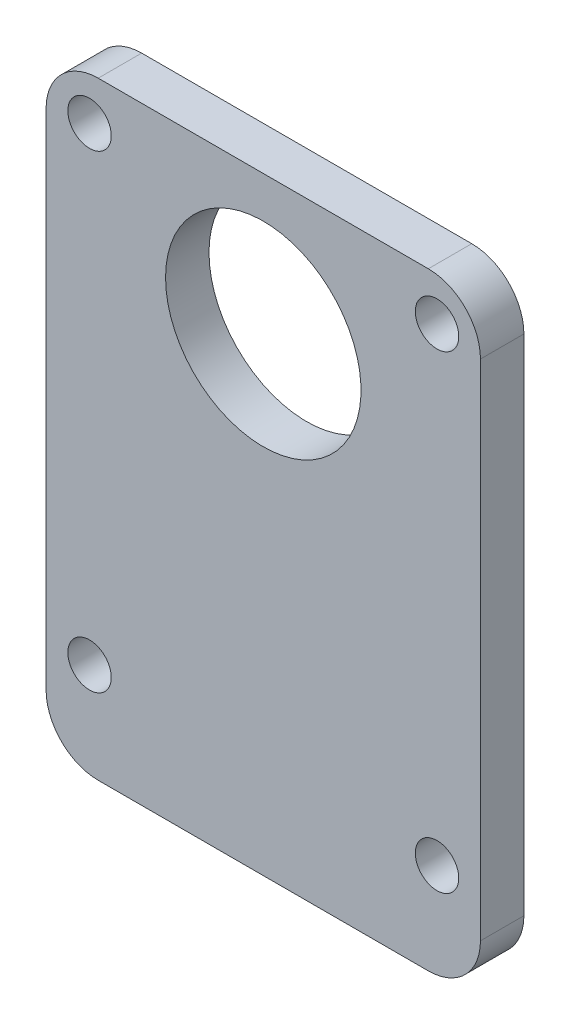
ISO-10303-21;
HEADER;
FILE_DESCRIPTION(('STEP AP214'),'2;1');
FILE_NAME('part.step','',(''),(''),'','','');
FILE_SCHEMA(('AUTOMOTIVE_DESIGN { 1 0 10303 214 1 1 1 1 }'));
ENDSEC;
DATA;
#1=APPLICATION_CONTEXT('core data for automotive mechanical design processes');
#2=APPLICATION_PROTOCOL_DEFINITION('international standard','automotive_design',2000,#1);
#3=PRODUCT_CONTEXT('',#1,'mechanical');
#4=PRODUCT('Part','Part','',(#3));
#5=PRODUCT_RELATED_PRODUCT_CATEGORY('part','',(#4));
#6=PRODUCT_DEFINITION_FORMATION('','',#4);
#7=PRODUCT_DEFINITION_CONTEXT('part definition',#1,'design');
#8=PRODUCT_DEFINITION('design','',#6,#7);
#9=PRODUCT_DEFINITION_SHAPE('','',#8);
#10=(LENGTH_UNIT() NAMED_UNIT(*) SI_UNIT(.MILLI.,.METRE.));
#11=(NAMED_UNIT(*) PLANE_ANGLE_UNIT() SI_UNIT($,.RADIAN.));
#12=(NAMED_UNIT(*) SI_UNIT($,.STERADIAN.) SOLID_ANGLE_UNIT());
#13=UNCERTAINTY_MEASURE_WITH_UNIT(LENGTH_MEASURE(1.E-05),#10,'distance_accuracy_value','');
#14=(GEOMETRIC_REPRESENTATION_CONTEXT(3) GLOBAL_UNCERTAINTY_ASSIGNED_CONTEXT((#13)) GLOBAL_UNIT_ASSIGNED_CONTEXT((#10,
#11,#12)) REPRESENTATION_CONTEXT('',''));
#15=CARTESIAN_POINT('',(0.,0.,0.));
#16=DIRECTION('',(0.,0.,1.));
#17=DIRECTION('',(1.,0.,0.));
#18=AXIS2_PLACEMENT_3D('',#15,#16,#17);
#19=CARTESIAN_POINT('',(-18.1,-22.0973062704397,-6.35));
#20=DIRECTION('',(0.,0.,-1.));
#21=DIRECTION('',(-1.,0.,0.));
#22=AXIS2_PLACEMENT_3D('',#19,#20,#21);
#23=PLANE('',#22);
#24=CARTESIAN_POINT('',(0.,17.8847845003735,-6.35));
#25=DIRECTION('',(0.,0.,-1.));
#26=DIRECTION('',(-1.,0.,0.));
#27=AXIS2_PLACEMENT_3D('',#24,#25,#26);
#28=CIRCLE('',#27,14.2875);
#29=CARTESIAN_POINT('',(-14.2875,17.8847845003735,-6.35));
#30=VERTEX_POINT('',#29);
#31=EDGE_CURVE('E192',#30,#30,#28,.T.);
#32=ORIENTED_EDGE('',*,*,#31,.F.);
#33=EDGE_LOOP('',(#32));
#34=FACE_BOUND('',#33,.T.);
#35=CARTESIAN_POINT('',(25.4,31.8547845003731,-6.35));
#36=DIRECTION('',(0.,0.,-1.));
#37=DIRECTION('',(-1.,0.,0.));
#38=AXIS2_PLACEMENT_3D('',#35,#36,#37);
#39=CIRCLE('',#38,3.175);
#40=CARTESIAN_POINT('',(22.225,31.8547845003731,-6.35));
#41=VERTEX_POINT('',#40);
#42=EDGE_CURVE('E187',#41,#41,#39,.T.);
#43=ORIENTED_EDGE('',*,*,#42,.F.);
#44=EDGE_LOOP('',(#43));
#45=FACE_BOUND('',#44,.T.);
#46=CARTESIAN_POINT('',(25.3999999999993,-36.7252154996269,-6.35));
#47=DIRECTION('',(0.,0.,-1.));
#48=DIRECTION('',(-1.,0.,0.));
#49=AXIS2_PLACEMENT_3D('',#46,#47,#48);
#50=CIRCLE('',#49,3.175);
#51=CARTESIAN_POINT('',(22.2249999999993,-36.7252154996269,-6.35));
#52=VERTEX_POINT('',#51);
#53=EDGE_CURVE('E181',#52,#52,#50,.T.);
#54=ORIENTED_EDGE('',*,*,#53,.F.);
#55=EDGE_LOOP('',(#54));
#56=FACE_BOUND('',#55,.T.);
#57=CARTESIAN_POINT('',(-25.4000000000007,-36.7252154996265,-6.35));
#58=DIRECTION('',(0.,0.,-1.));
#59=DIRECTION('',(-1.,0.,0.));
#60=AXIS2_PLACEMENT_3D('',#57,#58,#59);
#61=CIRCLE('',#60,3.175);
#62=CARTESIAN_POINT('',(-28.5750000000007,-36.7252154996265,-6.35));
#63=VERTEX_POINT('',#62);
#64=EDGE_CURVE('E174',#63,#63,#61,.T.);
#65=ORIENTED_EDGE('',*,*,#64,.F.);
#66=EDGE_LOOP('',(#65));
#67=FACE_BOUND('',#66,.T.);
#68=CARTESIAN_POINT('',(-25.4,31.8547845003735,-6.35));
#69=DIRECTION('',(0.,0.,-1.));
#70=DIRECTION('',(-1.,0.,0.));
#71=AXIS2_PLACEMENT_3D('',#68,#69,#70);
#72=CIRCLE('',#71,3.175);
#73=CARTESIAN_POINT('',(-28.575,31.8547845003735,-6.35));
#74=VERTEX_POINT('',#73);
#75=EDGE_CURVE('E168',#74,#74,#72,.T.);
#76=ORIENTED_EDGE('',*,*,#75,.F.);
#77=EDGE_LOOP('',(#76));
#78=FACE_BOUND('',#77,.T.);
#79=DIRECTION('',(-1.,0.,0.));
#80=VECTOR('',#79,1.);
#81=CARTESIAN_POINT('',(31.75,-50.6952154996265,-6.35));
#82=LINE('',#81,#80);
#83=CARTESIAN_POINT('',(24.13,-50.6952154996265,-6.35));
#84=VERTEX_POINT('',#83);
#85=CARTESIAN_POINT('',(-24.13,-50.6952154996265,-6.35));
#86=VERTEX_POINT('',#85);
#87=EDGE_CURVE('E102',#84,#86,#82,.T.);
#88=ORIENTED_EDGE('',*,*,#87,.T.);
#89=CARTESIAN_POINT('',(-24.13,-43.0752154996265,-6.35));
#90=DIRECTION('',(0.,0.,-1.));
#91=DIRECTION('',(-1.,0.,0.));
#92=AXIS2_PLACEMENT_3D('',#89,#90,#91);
#93=CIRCLE('',#92,7.62);
#94=CARTESIAN_POINT('',(-31.75,-43.0752154996265,-6.35));
#95=VERTEX_POINT('',#94);
#96=EDGE_CURVE('E109',#86,#95,#93,.T.);
#97=ORIENTED_EDGE('',*,*,#96,.T.);
#98=DIRECTION('',(0.,1.,0.));
#99=VECTOR('',#98,1.);
#100=CARTESIAN_POINT('',(-31.75,38.2047845003735,-6.35));
#101=LINE('',#100,#99);
#102=CARTESIAN_POINT('',(-31.75,30.5847845003735,-6.35));
#103=VERTEX_POINT('',#102);
#104=EDGE_CURVE('E158',#95,#103,#101,.T.);
#105=ORIENTED_EDGE('',*,*,#104,.T.);
#106=CARTESIAN_POINT('',(-24.13,30.5847845003735,-6.35));
#107=DIRECTION('',(0.,0.,-1.));
#108=DIRECTION('',(-1.,0.,0.));
#109=AXIS2_PLACEMENT_3D('',#106,#107,#108);
#110=CIRCLE('',#109,7.62);
#111=CARTESIAN_POINT('',(-24.13,38.2047845003735,-6.35));
#112=VERTEX_POINT('',#111);
#113=EDGE_CURVE('E110',#103,#112,#110,.T.);
#114=ORIENTED_EDGE('',*,*,#113,.T.);
#115=DIRECTION('',(1.,0.,0.));
#116=VECTOR('',#115,1.);
#117=CARTESIAN_POINT('',(31.75,38.2047845003735,-6.35));
#118=LINE('',#117,#116);
#119=CARTESIAN_POINT('',(24.13,38.2047845003735,-6.35));
#120=VERTEX_POINT('',#119);
#121=EDGE_CURVE('E154',#112,#120,#118,.T.);
#122=ORIENTED_EDGE('',*,*,#121,.T.);
#123=CARTESIAN_POINT('',(24.13,30.5847845003735,-6.35));
#124=DIRECTION('',(0.,0.,-1.));
#125=DIRECTION('',(-1.,0.,0.));
#126=AXIS2_PLACEMENT_3D('',#123,#124,#125);
#127=CIRCLE('',#126,7.62);
#128=CARTESIAN_POINT('',(31.75,30.5847845003735,-6.35));
#129=VERTEX_POINT('',#128);
#130=EDGE_CURVE('E127',#120,#129,#127,.T.);
#131=ORIENTED_EDGE('',*,*,#130,.T.);
#132=DIRECTION('',(0.,-1.,0.));
#133=VECTOR('',#132,1.);
#134=CARTESIAN_POINT('',(31.75,38.2047845003735,-6.35));
#135=LINE('',#134,#133);
#136=CARTESIAN_POINT('',(31.75,-43.0752154996265,-6.35));
#137=VERTEX_POINT('',#136);
#138=EDGE_CURVE('E104',#129,#137,#135,.T.);
#139=ORIENTED_EDGE('',*,*,#138,.T.);
#140=CARTESIAN_POINT('',(24.13,-43.0752154996265,-6.35));
#141=DIRECTION('',(0.,0.,-1.));
#142=DIRECTION('',(-1.,0.,0.));
#143=AXIS2_PLACEMENT_3D('',#140,#141,#142);
#144=CIRCLE('',#143,7.62);
#145=EDGE_CURVE('E100',#137,#84,#144,.T.);
#146=ORIENTED_EDGE('',*,*,#145,.T.);
#147=EDGE_LOOP('',(#88,#97,#105,#114,#122,#131,#139,#146));
#148=FACE_BOUND('',#147,.T.);
#149=ADVANCED_FACE('F35',(#34,#45,#56,#67,#78,#148),#23,.T.);
#150=CARTESIAN_POINT('',(-18.1,-22.0973062704397,0.));
#151=DIRECTION('',(0.,0.,-1.));
#152=DIRECTION('',(-1.,0.,0.));
#153=AXIS2_PLACEMENT_3D('',#150,#151,#152);
#154=PLANE('',#153);
#155=CARTESIAN_POINT('',(0.,17.8847845003735,0.));
#156=DIRECTION('',(0.,0.,-1.));
#157=DIRECTION('',(-1.,0.,0.));
#158=AXIS2_PLACEMENT_3D('',#155,#156,#157);
#159=CIRCLE('',#158,14.2875);
#160=CARTESIAN_POINT('',(-14.2875,17.8847845003735,0.));
#161=VERTEX_POINT('',#160);
#162=EDGE_CURVE('E178',#161,#161,#159,.T.);
#163=ORIENTED_EDGE('',*,*,#162,.T.);
#164=EDGE_LOOP('',(#163));
#165=FACE_BOUND('',#164,.T.);
#166=CARTESIAN_POINT('',(25.4,31.8547845003731,0.));
#167=DIRECTION('',(0.,0.,-1.));
#168=DIRECTION('',(-1.,0.,0.));
#169=AXIS2_PLACEMENT_3D('',#166,#167,#168);
#170=CIRCLE('',#169,3.175);
#171=CARTESIAN_POINT('',(22.225,31.8547845003731,0.));
#172=VERTEX_POINT('',#171);
#173=EDGE_CURVE('E171',#172,#172,#170,.T.);
#174=ORIENTED_EDGE('',*,*,#173,.T.);
#175=EDGE_LOOP('',(#174));
#176=FACE_BOUND('',#175,.T.);
#177=CARTESIAN_POINT('',(25.3999999999993,-36.7252154996269,0.));
#178=DIRECTION('',(0.,0.,-1.));
#179=DIRECTION('',(-1.,0.,0.));
#180=AXIS2_PLACEMENT_3D('',#177,#178,#179);
#181=CIRCLE('',#180,3.175);
#182=CARTESIAN_POINT('',(22.2249999999993,-36.7252154996269,0.));
#183=VERTEX_POINT('',#182);
#184=EDGE_CURVE('E184',#183,#183,#181,.T.);
#185=ORIENTED_EDGE('',*,*,#184,.T.);
#186=EDGE_LOOP('',(#185));
#187=FACE_BOUND('',#186,.T.);
#188=CARTESIAN_POINT('',(-25.4000000000007,-36.7252154996265,0.));
#189=DIRECTION('',(0.,0.,-1.));
#190=DIRECTION('',(-1.,0.,0.));
#191=AXIS2_PLACEMENT_3D('',#188,#189,#190);
#192=CIRCLE('',#191,3.175);
#193=CARTESIAN_POINT('',(-28.5750000000007,-36.7252154996265,0.));
#194=VERTEX_POINT('',#193);
#195=EDGE_CURVE('E177',#194,#194,#192,.T.);
#196=ORIENTED_EDGE('',*,*,#195,.T.);
#197=EDGE_LOOP('',(#196));
#198=FACE_BOUND('',#197,.T.);
#199=CARTESIAN_POINT('',(-25.4,31.8547845003735,0.));
#200=DIRECTION('',(0.,0.,-1.));
#201=DIRECTION('',(-1.,0.,0.));
#202=AXIS2_PLACEMENT_3D('',#199,#200,#201);
#203=CIRCLE('',#202,3.175);
#204=CARTESIAN_POINT('',(-28.575,31.8547845003735,0.));
#205=VERTEX_POINT('',#204);
#206=EDGE_CURVE('E160',#205,#205,#203,.T.);
#207=ORIENTED_EDGE('',*,*,#206,.T.);
#208=EDGE_LOOP('',(#207));
#209=FACE_BOUND('',#208,.T.);
#210=DIRECTION('',(0.,1.,0.));
#211=VECTOR('',#210,1.);
#212=CARTESIAN_POINT('',(-31.75,38.2047845003735,0.));
#213=LINE('',#212,#211);
#214=CARTESIAN_POINT('',(-31.75,-43.0752154996265,0.));
#215=VERTEX_POINT('',#214);
#216=CARTESIAN_POINT('',(-31.75,30.5847845003735,0.));
#217=VERTEX_POINT('',#216);
#218=EDGE_CURVE('E120',#215,#217,#213,.T.);
#219=ORIENTED_EDGE('',*,*,#218,.F.);
#220=CARTESIAN_POINT('',(-24.13,-43.0752154996265,0.));
#221=DIRECTION('',(0.,0.,-1.));
#222=DIRECTION('',(-1.,0.,0.));
#223=AXIS2_PLACEMENT_3D('',#220,#221,#222);
#224=CIRCLE('',#223,7.62);
#225=CARTESIAN_POINT('',(-24.13,-50.6952154996265,0.));
#226=VERTEX_POINT('',#225);
#227=EDGE_CURVE('E145',#215,#226,#224,.F.);
#228=ORIENTED_EDGE('',*,*,#227,.T.);
#229=DIRECTION('',(-1.,0.,0.));
#230=VECTOR('',#229,1.);
#231=CARTESIAN_POINT('',(31.75,-50.6952154996265,0.));
#232=LINE('',#231,#230);
#233=CARTESIAN_POINT('',(24.13,-50.6952154996265,0.));
#234=VERTEX_POINT('',#233);
#235=EDGE_CURVE('E125',#234,#226,#232,.T.);
#236=ORIENTED_EDGE('',*,*,#235,.F.);
#237=CARTESIAN_POINT('',(24.13,-43.0752154996265,0.));
#238=DIRECTION('',(0.,0.,-1.));
#239=DIRECTION('',(-1.,0.,0.));
#240=AXIS2_PLACEMENT_3D('',#237,#238,#239);
#241=CIRCLE('',#240,7.62);
#242=CARTESIAN_POINT('',(31.75,-43.0752154996265,0.));
#243=VERTEX_POINT('',#242);
#244=EDGE_CURVE('E124',#234,#243,#241,.F.);
#245=ORIENTED_EDGE('',*,*,#244,.T.);
#246=DIRECTION('',(0.,-1.,0.));
#247=VECTOR('',#246,1.);
#248=CARTESIAN_POINT('',(31.75,38.2047845003735,0.));
#249=LINE('',#248,#247);
#250=CARTESIAN_POINT('',(31.75,30.5847845003735,0.));
#251=VERTEX_POINT('',#250);
#252=EDGE_CURVE('E129',#251,#243,#249,.T.);
#253=ORIENTED_EDGE('',*,*,#252,.F.);
#254=CARTESIAN_POINT('',(24.13,30.5847845003735,0.));
#255=DIRECTION('',(0.,0.,-1.));
#256=DIRECTION('',(-1.,0.,0.));
#257=AXIS2_PLACEMENT_3D('',#254,#255,#256);
#258=CIRCLE('',#257,7.62);
#259=CARTESIAN_POINT('',(24.13,38.2047845003735,0.));
#260=VERTEX_POINT('',#259);
#261=EDGE_CURVE('E50',#251,#260,#258,.F.);
#262=ORIENTED_EDGE('',*,*,#261,.T.);
#263=DIRECTION('',(1.,0.,0.));
#264=VECTOR('',#263,1.);
#265=CARTESIAN_POINT('',(31.75,38.2047845003735,0.));
#266=LINE('',#265,#264);
#267=CARTESIAN_POINT('',(-24.13,38.2047845003735,0.));
#268=VERTEX_POINT('',#267);
#269=EDGE_CURVE('E155',#268,#260,#266,.T.);
#270=ORIENTED_EDGE('',*,*,#269,.F.);
#271=CARTESIAN_POINT('',(-24.13,30.5847845003735,0.));
#272=DIRECTION('',(0.,0.,-1.));
#273=DIRECTION('',(-1.,0.,0.));
#274=AXIS2_PLACEMENT_3D('',#271,#272,#273);
#275=CIRCLE('',#274,7.62);
#276=EDGE_CURVE('E142',#268,#217,#275,.F.);
#277=ORIENTED_EDGE('',*,*,#276,.T.);
#278=EDGE_LOOP('',(#219,#228,#236,#245,#253,#262,#270,#277));
#279=FACE_BOUND('',#278,.T.);
#280=ADVANCED_FACE('F198',(#165,#176,#187,#198,#209,#279),#154,.F.);
#281=CARTESIAN_POINT('',(-31.75,38.2047845003735,0.));
#282=DIRECTION('',(-1.,0.,0.));
#283=DIRECTION('',(0.,-1.,0.));
#284=AXIS2_PLACEMENT_3D('',#281,#282,#283);
#285=PLANE('',#284);
#286=ORIENTED_EDGE('',*,*,#104,.F.);
#287=DIRECTION('',(0.,0.,-1.));
#288=VECTOR('',#287,1.);
#289=CARTESIAN_POINT('',(-31.75,-43.0752154996265,0.));
#290=LINE('',#289,#288);
#291=EDGE_CURVE('E139',#95,#215,#290,.F.);
#292=ORIENTED_EDGE('',*,*,#291,.T.);
#293=ORIENTED_EDGE('',*,*,#218,.T.);
#294=DIRECTION('',(0.,0.,-1.));
#295=VECTOR('',#294,1.);
#296=CARTESIAN_POINT('',(-31.75,30.5847845003735,0.));
#297=LINE('',#296,#295);
#298=EDGE_CURVE('E136',#217,#103,#297,.T.);
#299=ORIENTED_EDGE('',*,*,#298,.T.);
#300=EDGE_LOOP('',(#286,#292,#293,#299));
#301=FACE_BOUND('',#300,.T.);
#302=ADVANCED_FACE('F237',(#301),#285,.T.);
#303=CARTESIAN_POINT('',(31.75,-50.6952154996265,0.));
#304=DIRECTION('',(0.,-1.,0.));
#305=DIRECTION('',(1.,0.,0.));
#306=AXIS2_PLACEMENT_3D('',#303,#304,#305);
#307=PLANE('',#306);
#308=ORIENTED_EDGE('',*,*,#235,.T.);
#309=DIRECTION('',(0.,0.,-1.));
#310=VECTOR('',#309,1.);
#311=CARTESIAN_POINT('',(-24.13,-50.6952154996265,0.));
#312=LINE('',#311,#310);
#313=EDGE_CURVE('E119',#226,#86,#312,.T.);
#314=ORIENTED_EDGE('',*,*,#313,.T.);
#315=ORIENTED_EDGE('',*,*,#87,.F.);
#316=DIRECTION('',(0.,0.,-1.));
#317=VECTOR('',#316,1.);
#318=CARTESIAN_POINT('',(24.13,-50.6952154996265,0.));
#319=LINE('',#318,#317);
#320=EDGE_CURVE('E116',#84,#234,#319,.F.);
#321=ORIENTED_EDGE('',*,*,#320,.T.);
#322=EDGE_LOOP('',(#308,#314,#315,#321));
#323=FACE_BOUND('',#322,.T.);
#324=ADVANCED_FACE('F115',(#323),#307,.T.);
#325=CARTESIAN_POINT('',(31.75,38.2047845003735,0.));
#326=DIRECTION('',(1.,0.,0.));
#327=DIRECTION('',(0.,1.,0.));
#328=AXIS2_PLACEMENT_3D('',#325,#326,#327);
#329=PLANE('',#328);
#330=ORIENTED_EDGE('',*,*,#252,.T.);
#331=DIRECTION('',(0.,0.,-1.));
#332=VECTOR('',#331,1.);
#333=CARTESIAN_POINT('',(31.75,-43.0752154996265,0.));
#334=LINE('',#333,#332);
#335=EDGE_CURVE('E149',#243,#137,#334,.T.);
#336=ORIENTED_EDGE('',*,*,#335,.T.);
#337=ORIENTED_EDGE('',*,*,#138,.F.);
#338=DIRECTION('',(0.,0.,-1.));
#339=VECTOR('',#338,1.);
#340=CARTESIAN_POINT('',(31.75,30.5847845003735,0.));
#341=LINE('',#340,#339);
#342=EDGE_CURVE('E147',#129,#251,#341,.F.);
#343=ORIENTED_EDGE('',*,*,#342,.T.);
#344=EDGE_LOOP('',(#330,#336,#337,#343));
#345=FACE_BOUND('',#344,.T.);
#346=ADVANCED_FACE('F230',(#345),#329,.T.);
#347=CARTESIAN_POINT('',(31.75,38.2047845003735,0.));
#348=DIRECTION('',(0.,1.,0.));
#349=DIRECTION('',(0.,0.,1.));
#350=AXIS2_PLACEMENT_3D('',#347,#348,#349);
#351=PLANE('',#350);
#352=ORIENTED_EDGE('',*,*,#121,.F.);
#353=DIRECTION('',(0.,0.,-1.));
#354=VECTOR('',#353,1.);
#355=CARTESIAN_POINT('',(-24.13,38.2047845003735,0.));
#356=LINE('',#355,#354);
#357=EDGE_CURVE('E11',#112,#268,#356,.F.);
#358=ORIENTED_EDGE('',*,*,#357,.T.);
#359=ORIENTED_EDGE('',*,*,#269,.T.);
#360=DIRECTION('',(0.,0.,-1.));
#361=VECTOR('',#360,1.);
#362=CARTESIAN_POINT('',(24.13,38.2047845003735,0.));
#363=LINE('',#362,#361);
#364=EDGE_CURVE('E43',#260,#120,#363,.T.);
#365=ORIENTED_EDGE('',*,*,#364,.T.);
#366=EDGE_LOOP('',(#352,#358,#359,#365));
#367=FACE_BOUND('',#366,.T.);
#368=ADVANCED_FACE('F153',(#367),#351,.T.);
#369=CARTESIAN_POINT('',(-25.4,31.8547845003735,0.));
#370=DIRECTION('',(0.,0.,-1.));
#371=DIRECTION('',(-1.,0.,0.));
#372=AXIS2_PLACEMENT_3D('',#369,#370,#371);
#373=CYLINDRICAL_SURFACE('',#372,3.175);
#374=ORIENTED_EDGE('',*,*,#206,.F.);
#375=EDGE_LOOP('',(#374));
#376=FACE_BOUND('',#375,.T.);
#377=ORIENTED_EDGE('',*,*,#75,.T.);
#378=EDGE_LOOP('',(#377));
#379=FACE_BOUND('',#378,.T.);
#380=ADVANCED_FACE('F218',(#376,#379),#373,.F.);
#381=CARTESIAN_POINT('',(-25.4000000000007,-36.7252154996265,0.));
#382=DIRECTION('',(0.,0.,-1.));
#383=DIRECTION('',(-1.,0.,0.));
#384=AXIS2_PLACEMENT_3D('',#381,#382,#383);
#385=CYLINDRICAL_SURFACE('',#384,3.175);
#386=ORIENTED_EDGE('',*,*,#195,.F.);
#387=EDGE_LOOP('',(#386));
#388=FACE_BOUND('',#387,.T.);
#389=ORIENTED_EDGE('',*,*,#64,.T.);
#390=EDGE_LOOP('',(#389));
#391=FACE_BOUND('',#390,.T.);
#392=ADVANCED_FACE('F220',(#388,#391),#385,.F.);
#393=CARTESIAN_POINT('',(25.3999999999993,-36.7252154996269,0.));
#394=DIRECTION('',(0.,0.,-1.));
#395=DIRECTION('',(-1.,0.,0.));
#396=AXIS2_PLACEMENT_3D('',#393,#394,#395);
#397=CYLINDRICAL_SURFACE('',#396,3.175);
#398=ORIENTED_EDGE('',*,*,#184,.F.);
#399=EDGE_LOOP('',(#398));
#400=FACE_BOUND('',#399,.T.);
#401=ORIENTED_EDGE('',*,*,#53,.T.);
#402=EDGE_LOOP('',(#401));
#403=FACE_BOUND('',#402,.T.);
#404=ADVANCED_FACE('F227',(#400,#403),#397,.F.);
#405=CARTESIAN_POINT('',(25.4,31.8547845003731,0.));
#406=DIRECTION('',(0.,0.,-1.));
#407=DIRECTION('',(-1.,0.,0.));
#408=AXIS2_PLACEMENT_3D('',#405,#406,#407);
#409=CYLINDRICAL_SURFACE('',#408,3.175);
#410=ORIENTED_EDGE('',*,*,#173,.F.);
#411=EDGE_LOOP('',(#410));
#412=FACE_BOUND('',#411,.T.);
#413=ORIENTED_EDGE('',*,*,#42,.T.);
#414=EDGE_LOOP('',(#413));
#415=FACE_BOUND('',#414,.T.);
#416=ADVANCED_FACE('F249',(#412,#415),#409,.F.);
#417=CARTESIAN_POINT('',(-24.13,-43.0752154996265,0.));
#418=DIRECTION('',(0.,0.,-1.));
#419=DIRECTION('',(-1.,0.,0.));
#420=AXIS2_PLACEMENT_3D('',#417,#418,#419);
#421=CYLINDRICAL_SURFACE('',#420,7.62);
#422=ORIENTED_EDGE('',*,*,#227,.F.);
#423=ORIENTED_EDGE('',*,*,#291,.F.);
#424=ORIENTED_EDGE('',*,*,#96,.F.);
#425=ORIENTED_EDGE('',*,*,#313,.F.);
#426=EDGE_LOOP('',(#422,#423,#424,#425));
#427=FACE_BOUND('',#426,.T.);
#428=ADVANCED_FACE('F246',(#427),#421,.T.);
#429=CARTESIAN_POINT('',(24.13,-43.0752154996265,0.));
#430=DIRECTION('',(0.,0.,-1.));
#431=DIRECTION('',(-1.,0.,0.));
#432=AXIS2_PLACEMENT_3D('',#429,#430,#431);
#433=CYLINDRICAL_SURFACE('',#432,7.62);
#434=ORIENTED_EDGE('',*,*,#244,.F.);
#435=ORIENTED_EDGE('',*,*,#320,.F.);
#436=ORIENTED_EDGE('',*,*,#145,.F.);
#437=ORIENTED_EDGE('',*,*,#335,.F.);
#438=EDGE_LOOP('',(#434,#435,#436,#437));
#439=FACE_BOUND('',#438,.T.);
#440=ADVANCED_FACE('F123',(#439),#433,.T.);
#441=CARTESIAN_POINT('',(-24.13,30.5847845003735,0.));
#442=DIRECTION('',(0.,0.,-1.));
#443=DIRECTION('',(-1.,0.,0.));
#444=AXIS2_PLACEMENT_3D('',#441,#442,#443);
#445=CYLINDRICAL_SURFACE('',#444,7.62);
#446=ORIENTED_EDGE('',*,*,#276,.F.);
#447=ORIENTED_EDGE('',*,*,#357,.F.);
#448=ORIENTED_EDGE('',*,*,#113,.F.);
#449=ORIENTED_EDGE('',*,*,#298,.F.);
#450=EDGE_LOOP('',(#446,#447,#448,#449));
#451=FACE_BOUND('',#450,.T.);
#452=ADVANCED_FACE('F252',(#451),#445,.T.);
#453=CARTESIAN_POINT('',(24.13,30.5847845003735,0.));
#454=DIRECTION('',(0.,0.,-1.));
#455=DIRECTION('',(-1.,0.,0.));
#456=AXIS2_PLACEMENT_3D('',#453,#454,#455);
#457=CYLINDRICAL_SURFACE('',#456,7.62);
#458=ORIENTED_EDGE('',*,*,#261,.F.);
#459=ORIENTED_EDGE('',*,*,#342,.F.);
#460=ORIENTED_EDGE('',*,*,#130,.F.);
#461=ORIENTED_EDGE('',*,*,#364,.F.);
#462=EDGE_LOOP('',(#458,#459,#460,#461));
#463=FACE_BOUND('',#462,.T.);
#464=ADVANCED_FACE('F37',(#463),#457,.T.);
#465=CARTESIAN_POINT('',(0.,17.8847845003735,0.));
#466=DIRECTION('',(0.,0.,-1.));
#467=DIRECTION('',(-1.,0.,0.));
#468=AXIS2_PLACEMENT_3D('',#465,#466,#467);
#469=CYLINDRICAL_SURFACE('',#468,14.2875);
#470=ORIENTED_EDGE('',*,*,#162,.F.);
#471=EDGE_LOOP('',(#470));
#472=FACE_BOUND('',#471,.T.);
#473=ORIENTED_EDGE('',*,*,#31,.T.);
#474=EDGE_LOOP('',(#473));
#475=FACE_BOUND('',#474,.T.);
#476=ADVANCED_FACE('F201',(#472,#475),#469,.F.);
#477=CLOSED_SHELL('',(#149,#280,#302,#324,#346,#368,#380,#392,#404,#416,#428,#440,#452,#464,#476));
#478=MANIFOLD_SOLID_BREP('B2',#477);
#479=ADVANCED_BREP_SHAPE_REPRESENTATION('',(#18,#478),#14);
#480=SHAPE_DEFINITION_REPRESENTATION(#9,#479);
ENDSEC;
END-ISO-10303-21;
